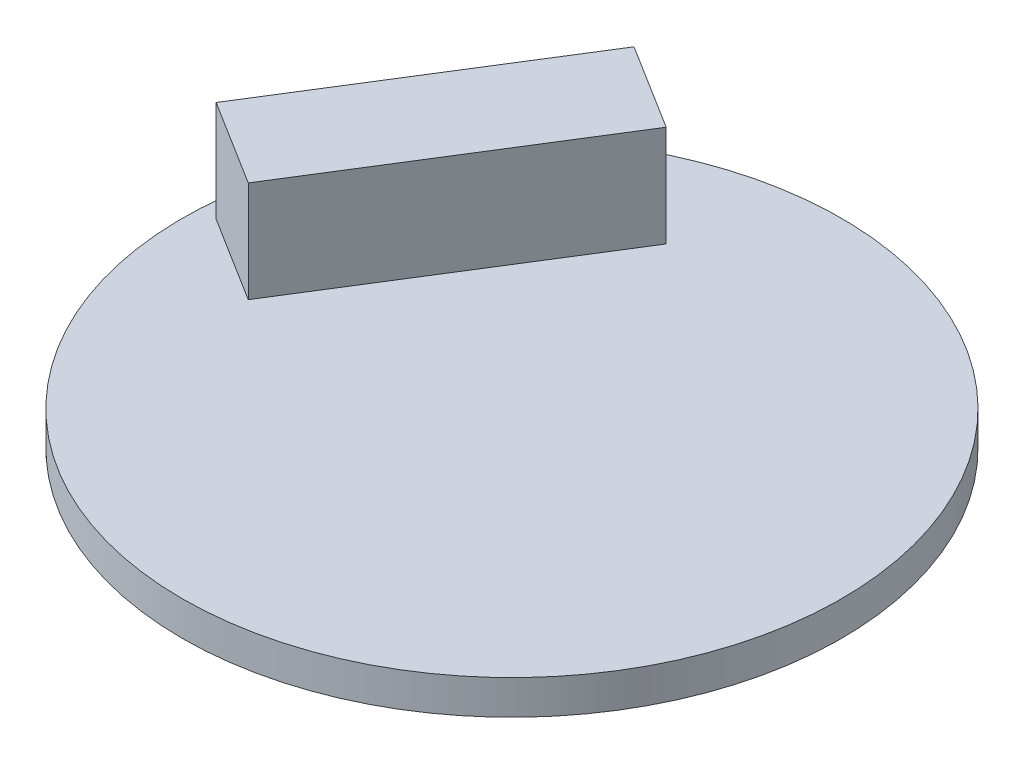
ISO-10303-21;
HEADER;
FILE_DESCRIPTION(('STEP AP214'),'2;1');
FILE_NAME('part.step','',(''),(''),'','','');
FILE_SCHEMA(('AUTOMOTIVE_DESIGN { 1 0 10303 214 1 1 1 1 }'));
ENDSEC;
DATA;
#1=APPLICATION_CONTEXT('core data for automotive mechanical design processes');
#2=APPLICATION_PROTOCOL_DEFINITION('international standard','automotive_design',2000,#1);
#3=PRODUCT_CONTEXT('',#1,'mechanical');
#4=PRODUCT('Part','Part','',(#3));
#5=PRODUCT_RELATED_PRODUCT_CATEGORY('part','',(#4));
#6=PRODUCT_DEFINITION_FORMATION('','',#4);
#7=PRODUCT_DEFINITION_CONTEXT('part definition',#1,'design');
#8=PRODUCT_DEFINITION('design','',#6,#7);
#9=PRODUCT_DEFINITION_SHAPE('','',#8);
#10=(LENGTH_UNIT() NAMED_UNIT(*) SI_UNIT(.MILLI.,.METRE.));
#11=(NAMED_UNIT(*) PLANE_ANGLE_UNIT() SI_UNIT($,.RADIAN.));
#12=(NAMED_UNIT(*) SI_UNIT($,.STERADIAN.) SOLID_ANGLE_UNIT());
#13=UNCERTAINTY_MEASURE_WITH_UNIT(LENGTH_MEASURE(1.E-05),#10,'distance_accuracy_value','');
#14=(GEOMETRIC_REPRESENTATION_CONTEXT(3) GLOBAL_UNCERTAINTY_ASSIGNED_CONTEXT((#13)) GLOBAL_UNIT_ASSIGNED_CONTEXT((#10,
#11,#12)) REPRESENTATION_CONTEXT('',''));
#15=CARTESIAN_POINT('',(0.,0.,0.));
#16=DIRECTION('',(0.,0.,1.));
#17=DIRECTION('',(1.,0.,0.));
#18=AXIS2_PLACEMENT_3D('',#15,#16,#17);
#19=CARTESIAN_POINT('',(0.,1.7,0.));
#20=DIRECTION('',(0.,1.,0.));
#21=DIRECTION('',(0.,0.,1.));
#22=AXIS2_PLACEMENT_3D('',#19,#20,#21);
#23=PLANE('',#22);
#24=CARTESIAN_POINT('',(0.,1.7,0.));
#25=DIRECTION('',(0.,1.,0.));
#26=DIRECTION('',(0.,0.,1.));
#27=AXIS2_PLACEMENT_3D('',#24,#25,#26);
#28=CIRCLE('',#27,16.3);
#29=CARTESIAN_POINT('',(0.,1.7,16.3));
#30=VERTEX_POINT('',#29);
#31=EDGE_CURVE('E11',#30,#30,#28,.T.);
#32=ORIENTED_EDGE('',*,*,#31,.T.);
#33=EDGE_LOOP('',(#32));
#34=FACE_BOUND('',#33,.T.);
#35=DIRECTION('',(0.529919264233205,0.,-0.848048096156426));
#36=VECTOR('',#35,1.);
#37=CARTESIAN_POINT('',(-11.1828032990786,1.7,1.85604697519094));
#38=LINE('',#37,#36);
#39=CARTESIAN_POINT('',(-11.1828032990786,1.7,1.85604697519094));
#40=VERTEX_POINT('',#39);
#41=CARTESIAN_POINT('',(-3.23401433558057,1.7,-10.8646744671555));
#42=VERTEX_POINT('',#41);
#43=EDGE_CURVE('E157',#40,#42,#38,.T.);
#44=ORIENTED_EDGE('',*,*,#43,.F.);
#45=DIRECTION('',(0.848048096156426,0.,0.529919264233205));
#46=VECTOR('',#45,1.);
#47=CARTESIAN_POINT('',(-15.4230437798608,1.7,-0.793549345975089));
#48=LINE('',#47,#46);
#49=CARTESIAN_POINT('',(-15.4230437798608,1.7,-0.793549345975089));
#50=VERTEX_POINT('',#49);
#51=EDGE_CURVE('E140',#50,#40,#48,.T.);
#52=ORIENTED_EDGE('',*,*,#51,.F.);
#53=DIRECTION('',(-0.529919264233205,0.,0.848048096156426));
#54=VECTOR('',#53,1.);
#55=CARTESIAN_POINT('',(-7.4742548163627,1.7,-13.5142707883215));
#56=LINE('',#55,#54);
#57=CARTESIAN_POINT('',(-7.4742548163627,1.7,-13.5142707883215));
#58=VERTEX_POINT('',#57);
#59=EDGE_CURVE('E148',#58,#50,#56,.T.);
#60=ORIENTED_EDGE('',*,*,#59,.F.);
#61=DIRECTION('',(-0.848048096156426,0.,-0.529919264233204));
#62=VECTOR('',#61,1.);
#63=CARTESIAN_POINT('',(-3.23401433558057,1.7,-10.8646744671555));
#64=LINE('',#63,#62);
#65=EDGE_CURVE('E159',#42,#58,#64,.T.);
#66=ORIENTED_EDGE('',*,*,#65,.F.);
#67=EDGE_LOOP('',(#44,#52,#60,#66));
#68=FACE_BOUND('',#67,.T.);
#69=ADVANCED_FACE('F39',(#34,#68),#23,.T.);
#70=CARTESIAN_POINT('',(0.,1.7,0.));
#71=DIRECTION('',(0.,-1.,0.));
#72=DIRECTION('',(0.,0.,-1.));
#73=AXIS2_PLACEMENT_3D('',#70,#71,#72);
#74=CYLINDRICAL_SURFACE('',#73,16.3);
#75=ORIENTED_EDGE('',*,*,#31,.F.);
#76=EDGE_LOOP('',(#75));
#77=FACE_BOUND('',#76,.T.);
#78=CARTESIAN_POINT('',(0.,0.,0.));
#79=DIRECTION('',(0.,1.,0.));
#80=DIRECTION('',(0.,0.,1.));
#81=AXIS2_PLACEMENT_3D('',#78,#79,#80);
#82=CIRCLE('',#81,16.3);
#83=CARTESIAN_POINT('',(0.,0.,16.3));
#84=VERTEX_POINT('',#83);
#85=EDGE_CURVE('E43',#84,#84,#82,.T.);
#86=ORIENTED_EDGE('',*,*,#85,.T.);
#87=EDGE_LOOP('',(#86));
#88=FACE_BOUND('',#87,.T.);
#89=ADVANCED_FACE('F41',(#77,#88),#74,.T.);
#90=CARTESIAN_POINT('',(0.,0.,0.));
#91=DIRECTION('',(0.,1.,0.));
#92=DIRECTION('',(0.,0.,1.));
#93=AXIS2_PLACEMENT_3D('',#90,#91,#92);
#94=PLANE('',#93);
#95=ORIENTED_EDGE('',*,*,#85,.F.);
#96=EDGE_LOOP('',(#95));
#97=FACE_BOUND('',#96,.T.);
#98=ADVANCED_FACE('F175',(#97),#94,.F.);
#99=CARTESIAN_POINT('',(-15.4230437798608,6.7,-0.793549345975089));
#100=DIRECTION('',(0.529919264233205,0.,-0.848048096156426));
#101=DIRECTION('',(-0.848048096156426,0.,-0.529919264233205));
#102=AXIS2_PLACEMENT_3D('',#99,#100,#101);
#103=PLANE('',#102);
#104=ORIENTED_EDGE('',*,*,#51,.T.);
#105=DIRECTION('',(0.,-1.,0.));
#106=VECTOR('',#105,1.);
#107=CARTESIAN_POINT('',(-11.1828032990786,6.7,1.85604697519094));
#108=LINE('',#107,#106);
#109=CARTESIAN_POINT('',(-11.1828032990786,6.7,1.85604697519094));
#110=VERTEX_POINT('',#109);
#111=EDGE_CURVE('E168',#110,#40,#108,.T.);
#112=ORIENTED_EDGE('',*,*,#111,.F.);
#113=DIRECTION('',(0.848048096156426,0.,0.529919264233205));
#114=VECTOR('',#113,1.);
#115=CARTESIAN_POINT('',(-15.4230437798608,6.7,-0.793549345975089));
#116=LINE('',#115,#114);
#117=CARTESIAN_POINT('',(-15.4230437798608,6.7,-0.793549345975089));
#118=VERTEX_POINT('',#117);
#119=EDGE_CURVE('E144',#118,#110,#116,.T.);
#120=ORIENTED_EDGE('',*,*,#119,.F.);
#121=DIRECTION('',(0.,-1.,0.));
#122=VECTOR('',#121,1.);
#123=CARTESIAN_POINT('',(-15.4230437798608,6.7,-0.793549345975089));
#124=LINE('',#123,#122);
#125=EDGE_CURVE('E154',#118,#50,#124,.T.);
#126=ORIENTED_EDGE('',*,*,#125,.T.);
#127=EDGE_LOOP('',(#104,#112,#120,#126));
#128=FACE_BOUND('',#127,.T.);
#129=ADVANCED_FACE('F177',(#128),#103,.F.);
#130=CARTESIAN_POINT('',(-11.1828032990786,6.7,1.85604697519094));
#131=DIRECTION('',(-0.848048096156426,0.,-0.529919264233205));
#132=DIRECTION('',(-0.529919264233205,0.,0.848048096156426));
#133=AXIS2_PLACEMENT_3D('',#130,#131,#132);
#134=PLANE('',#133);
#135=ORIENTED_EDGE('',*,*,#43,.T.);
#136=DIRECTION('',(0.,-1.,0.));
#137=VECTOR('',#136,1.);
#138=CARTESIAN_POINT('',(-3.23401433558057,6.7,-10.8646744671555));
#139=LINE('',#138,#137);
#140=CARTESIAN_POINT('',(-3.23401433558057,6.7,-10.8646744671555));
#141=VERTEX_POINT('',#140);
#142=EDGE_CURVE('E165',#141,#42,#139,.T.);
#143=ORIENTED_EDGE('',*,*,#142,.F.);
#144=DIRECTION('',(0.529919264233205,0.,-0.848048096156426));
#145=VECTOR('',#144,1.);
#146=CARTESIAN_POINT('',(-11.1828032990786,6.7,1.85604697519094));
#147=LINE('',#146,#145);
#148=EDGE_CURVE('E147',#110,#141,#147,.T.);
#149=ORIENTED_EDGE('',*,*,#148,.F.);
#150=ORIENTED_EDGE('',*,*,#111,.T.);
#151=EDGE_LOOP('',(#135,#143,#149,#150));
#152=FACE_BOUND('',#151,.T.);
#153=ADVANCED_FACE('F183',(#152),#134,.F.);
#154=CARTESIAN_POINT('',(-3.23401433558057,6.7,-10.8646744671555));
#155=DIRECTION('',(-0.529919264233204,0.,0.848048096156426));
#156=DIRECTION('',(0.848048096156426,0.,0.529919264233204));
#157=AXIS2_PLACEMENT_3D('',#154,#155,#156);
#158=PLANE('',#157);
#159=ORIENTED_EDGE('',*,*,#65,.T.);
#160=DIRECTION('',(0.,-1.,0.));
#161=VECTOR('',#160,1.);
#162=CARTESIAN_POINT('',(-7.4742548163627,6.7,-13.5142707883215));
#163=LINE('',#162,#161);
#164=CARTESIAN_POINT('',(-7.4742548163627,6.7,-13.5142707883215));
#165=VERTEX_POINT('',#164);
#166=EDGE_CURVE('E62',#165,#58,#163,.T.);
#167=ORIENTED_EDGE('',*,*,#166,.F.);
#168=DIRECTION('',(-0.848048096156426,0.,-0.529919264233204));
#169=VECTOR('',#168,1.);
#170=CARTESIAN_POINT('',(-3.23401433558057,6.7,-10.8646744671555));
#171=LINE('',#170,#169);
#172=EDGE_CURVE('E150',#141,#165,#171,.T.);
#173=ORIENTED_EDGE('',*,*,#172,.F.);
#174=ORIENTED_EDGE('',*,*,#142,.T.);
#175=EDGE_LOOP('',(#159,#167,#173,#174));
#176=FACE_BOUND('',#175,.T.);
#177=ADVANCED_FACE('F197',(#176),#158,.F.);
#178=CARTESIAN_POINT('',(-7.4742548163627,6.7,-13.5142707883215));
#179=DIRECTION('',(0.848048096156426,0.,0.529919264233205));
#180=DIRECTION('',(0.529919264233205,0.,-0.848048096156426));
#181=AXIS2_PLACEMENT_3D('',#178,#179,#180);
#182=PLANE('',#181);
#183=DIRECTION('',(-0.529919264233205,0.,0.848048096156426));
#184=VECTOR('',#183,1.);
#185=CARTESIAN_POINT('',(-14.869937361534,2.59235008137179,-1.67870464545759));
#186=LINE('',#185,#184);
#187=CARTESIAN_POINT('',(-8.02736123468945,2.59235008137179,-12.629115488839));
#188=VERTEX_POINT('',#187);
#189=CARTESIAN_POINT('',(-14.869937361534,2.59235008137179,-1.67870464545759));
#190=VERTEX_POINT('',#189);
#191=EDGE_CURVE('E134',#188,#190,#186,.T.);
#192=ORIENTED_EDGE('',*,*,#191,.F.);
#193=DIRECTION('',(0.,-1.,0.));
#194=VECTOR('',#193,1.);
#195=CARTESIAN_POINT('',(-8.02736123468945,5.80764991862821,-12.629115488839));
#196=LINE('',#195,#194);
#197=CARTESIAN_POINT('',(-8.02736123468945,5.80764991862821,-12.629115488839));
#198=VERTEX_POINT('',#197);
#199=EDGE_CURVE('E54',#198,#188,#196,.T.);
#200=ORIENTED_EDGE('',*,*,#199,.F.);
#201=DIRECTION('',(0.529919264233205,0.,-0.848048096156426));
#202=VECTOR('',#201,1.);
#203=CARTESIAN_POINT('',(-14.869937361534,5.80764991862821,-1.67870464545759));
#204=LINE('',#203,#202);
#205=CARTESIAN_POINT('',(-14.869937361534,5.80764991862821,-1.67870464545759));
#206=VERTEX_POINT('',#205);
#207=EDGE_CURVE('E125',#206,#198,#204,.T.);
#208=ORIENTED_EDGE('',*,*,#207,.F.);
#209=DIRECTION('',(0.,1.,0.));
#210=VECTOR('',#209,1.);
#211=CARTESIAN_POINT('',(-14.869937361534,5.80764991862821,-1.67870464545759));
#212=LINE('',#211,#210);
#213=EDGE_CURVE('E128',#190,#206,#212,.T.);
#214=ORIENTED_EDGE('',*,*,#213,.F.);
#215=EDGE_LOOP('',(#192,#200,#208,#214));
#216=FACE_BOUND('',#215,.T.);
#217=ORIENTED_EDGE('',*,*,#59,.T.);
#218=ORIENTED_EDGE('',*,*,#125,.F.);
#219=DIRECTION('',(-0.529919264233205,0.,0.848048096156426));
#220=VECTOR('',#219,1.);
#221=CARTESIAN_POINT('',(-7.4742548163627,6.7,-13.5142707883215));
#222=LINE('',#221,#220);
#223=EDGE_CURVE('E152',#165,#118,#222,.T.);
#224=ORIENTED_EDGE('',*,*,#223,.F.);
#225=ORIENTED_EDGE('',*,*,#166,.T.);
#226=EDGE_LOOP('',(#217,#218,#224,#225));
#227=FACE_BOUND('',#226,.T.);
#228=ADVANCED_FACE('F200',(#216,#227),#182,.F.);
#229=CARTESIAN_POINT('',(0.,6.7,0.));
#230=DIRECTION('',(0.,1.,0.));
#231=DIRECTION('',(0.,0.,1.));
#232=AXIS2_PLACEMENT_3D('',#229,#230,#231);
#233=PLANE('',#232);
#234=ORIENTED_EDGE('',*,*,#119,.T.);
#235=ORIENTED_EDGE('',*,*,#148,.T.);
#236=ORIENTED_EDGE('',*,*,#172,.T.);
#237=ORIENTED_EDGE('',*,*,#223,.T.);
#238=EDGE_LOOP('',(#234,#235,#236,#237));
#239=FACE_BOUND('',#238,.T.);
#240=ADVANCED_FACE('F204',(#239),#233,.T.);
#241=CARTESIAN_POINT('',(-4.63516885006375,5.80764991862821,-10.5094384319061));
#242=DIRECTION('',(0.529919264233205,0.,-0.848048096156426));
#243=DIRECTION('',(-0.848048096156426,0.,-0.529919264233205));
#244=AXIS2_PLACEMENT_3D('',#241,#242,#243);
#245=PLANE('',#244);
#246=ORIENTED_EDGE('',*,*,#199,.T.);
#247=DIRECTION('',(-0.848048096156426,0.,-0.529919264233205));
#248=VECTOR('',#247,1.);
#249=CARTESIAN_POINT('',(-4.63516885006375,2.59235008137179,-10.5094384319061));
#250=LINE('',#249,#248);
#251=CARTESIAN_POINT('',(-4.63516885006375,2.59235008137179,-10.5094384319061));
#252=VERTEX_POINT('',#251);
#253=EDGE_CURVE('E103',#252,#188,#250,.T.);
#254=ORIENTED_EDGE('',*,*,#253,.F.);
#255=DIRECTION('',(0.,-1.,0.));
#256=VECTOR('',#255,1.);
#257=CARTESIAN_POINT('',(-4.63516885006375,5.80764991862821,-10.5094384319061));
#258=LINE('',#257,#256);
#259=CARTESIAN_POINT('',(-4.63516885006375,5.80764991862821,-10.5094384319061));
#260=VERTEX_POINT('',#259);
#261=EDGE_CURVE('E107',#260,#252,#258,.T.);
#262=ORIENTED_EDGE('',*,*,#261,.F.);
#263=DIRECTION('',(-0.848048096156426,0.,-0.529919264233205));
#264=VECTOR('',#263,1.);
#265=CARTESIAN_POINT('',(-4.63516885006375,5.80764991862821,-10.5094384319061));
#266=LINE('',#265,#264);
#267=EDGE_CURVE('E138',#260,#198,#266,.T.);
#268=ORIENTED_EDGE('',*,*,#267,.T.);
#269=EDGE_LOOP('',(#246,#254,#262,#268));
#270=FACE_BOUND('',#269,.T.);
#271=ADVANCED_FACE('F105',(#270),#245,.F.);
#272=CARTESIAN_POINT('',(-11.4777449769083,5.80764991862821,0.440972411475229));
#273=DIRECTION('',(0.,1.,0.));
#274=DIRECTION('',(0.,0.,1.));
#275=AXIS2_PLACEMENT_3D('',#272,#273,#274);
#276=PLANE('',#275);
#277=ORIENTED_EDGE('',*,*,#207,.T.);
#278=ORIENTED_EDGE('',*,*,#267,.F.);
#279=DIRECTION('',(0.529919264233205,0.,-0.848048096156426));
#280=VECTOR('',#279,1.);
#281=CARTESIAN_POINT('',(-11.4777449769083,5.80764991862821,0.440972411475229));
#282=LINE('',#281,#280);
#283=CARTESIAN_POINT('',(-11.4777449769083,5.80764991862821,0.440972411475229));
#284=VERTEX_POINT('',#283);
#285=EDGE_CURVE('E113',#284,#260,#282,.T.);
#286=ORIENTED_EDGE('',*,*,#285,.F.);
#287=DIRECTION('',(-0.848048096156426,0.,-0.529919264233205));
#288=VECTOR('',#287,1.);
#289=CARTESIAN_POINT('',(-11.4777449769083,5.80764991862821,0.440972411475229));
#290=LINE('',#289,#288);
#291=EDGE_CURVE('E141',#284,#206,#290,.T.);
#292=ORIENTED_EDGE('',*,*,#291,.T.);
#293=EDGE_LOOP('',(#277,#278,#286,#292));
#294=FACE_BOUND('',#293,.T.);
#295=ADVANCED_FACE('F211',(#294),#276,.F.);
#296=CARTESIAN_POINT('',(-11.4777449769083,5.80764991862821,0.440972411475229));
#297=DIRECTION('',(-0.529919264233205,0.,0.848048096156426));
#298=DIRECTION('',(0.848048096156426,0.,0.529919264233205));
#299=AXIS2_PLACEMENT_3D('',#296,#297,#298);
#300=PLANE('',#299);
#301=ORIENTED_EDGE('',*,*,#213,.T.);
#302=ORIENTED_EDGE('',*,*,#291,.F.);
#303=DIRECTION('',(0.,1.,0.));
#304=VECTOR('',#303,1.);
#305=CARTESIAN_POINT('',(-11.4777449769083,5.80764991862821,0.440972411475229));
#306=LINE('',#305,#304);
#307=CARTESIAN_POINT('',(-11.4777449769083,2.59235008137179,0.440972411475229));
#308=VERTEX_POINT('',#307);
#309=EDGE_CURVE('E121',#308,#284,#306,.T.);
#310=ORIENTED_EDGE('',*,*,#309,.F.);
#311=DIRECTION('',(-0.848048096156426,0.,-0.529919264233205));
#312=VECTOR('',#311,1.);
#313=CARTESIAN_POINT('',(-11.4777449769083,2.59235008137179,0.440972411475229));
#314=LINE('',#313,#312);
#315=EDGE_CURVE('E112',#308,#190,#314,.T.);
#316=ORIENTED_EDGE('',*,*,#315,.T.);
#317=EDGE_LOOP('',(#301,#302,#310,#316));
#318=FACE_BOUND('',#317,.T.);
#319=ADVANCED_FACE('F214',(#318),#300,.F.);
#320=CARTESIAN_POINT('',(-11.4777449769083,2.59235008137179,0.440972411475229));
#321=DIRECTION('',(0.,-1.,0.));
#322=DIRECTION('',(0.,0.,-1.));
#323=AXIS2_PLACEMENT_3D('',#320,#321,#322);
#324=PLANE('',#323);
#325=ORIENTED_EDGE('',*,*,#191,.T.);
#326=ORIENTED_EDGE('',*,*,#315,.F.);
#327=DIRECTION('',(-0.529919264233205,0.,0.848048096156426));
#328=VECTOR('',#327,1.);
#329=CARTESIAN_POINT('',(-11.4777449769083,2.59235008137179,0.440972411475229));
#330=LINE('',#329,#328);
#331=EDGE_CURVE('E116',#252,#308,#330,.T.);
#332=ORIENTED_EDGE('',*,*,#331,.F.);
#333=ORIENTED_EDGE('',*,*,#253,.T.);
#334=EDGE_LOOP('',(#325,#326,#332,#333));
#335=FACE_BOUND('',#334,.T.);
#336=ADVANCED_FACE('F117',(#335),#324,.F.);
#337=CARTESIAN_POINT('',(-8.05645691348605,0.,-5.03423301021545));
#338=DIRECTION('',(0.848048096156426,0.,0.529919264233205));
#339=DIRECTION('',(0.529919264233205,0.,-0.848048096156426));
#340=AXIS2_PLACEMENT_3D('',#337,#338,#339);
#341=PLANE('',#340);
#342=ORIENTED_EDGE('',*,*,#261,.T.);
#343=ORIENTED_EDGE('',*,*,#331,.T.);
#344=ORIENTED_EDGE('',*,*,#309,.T.);
#345=ORIENTED_EDGE('',*,*,#285,.T.);
#346=EDGE_LOOP('',(#342,#343,#344,#345));
#347=FACE_BOUND('',#346,.T.);
#348=ADVANCED_FACE('F123',(#347),#341,.F.);
#349=CLOSED_SHELL('',(#69,#89,#98,#129,#153,#177,#228,#240,#271,#295,#319,#336,#348));
#350=MANIFOLD_SOLID_BREP('B2',#349);
#351=ADVANCED_BREP_SHAPE_REPRESENTATION('',(#18,#350),#14);
#352=SHAPE_DEFINITION_REPRESENTATION(#9,#351);
ENDSEC;
END-ISO-10303-21;
